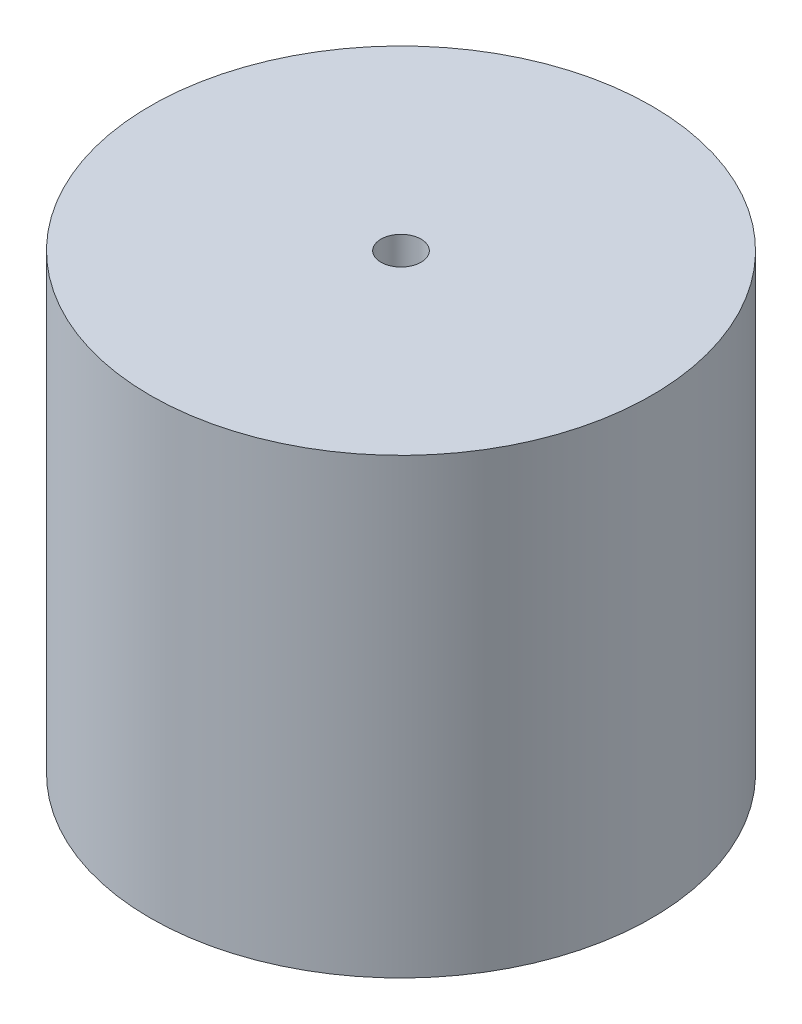
ISO-10303-21;
HEADER;
FILE_DESCRIPTION(('STEP AP214'),'2;1');
FILE_NAME('part.step','',(''),(''),'','','');
FILE_SCHEMA(('AUTOMOTIVE_DESIGN { 1 0 10303 214 1 1 1 1 }'));
ENDSEC;
DATA;
#1=APPLICATION_CONTEXT('core data for automotive mechanical design processes');
#2=APPLICATION_PROTOCOL_DEFINITION('international standard','automotive_design',2000,#1);
#3=PRODUCT_CONTEXT('',#1,'mechanical');
#4=PRODUCT('Part','Part','',(#3));
#5=PRODUCT_RELATED_PRODUCT_CATEGORY('part','',(#4));
#6=PRODUCT_DEFINITION_FORMATION('','',#4);
#7=PRODUCT_DEFINITION_CONTEXT('part definition',#1,'design');
#8=PRODUCT_DEFINITION('design','',#6,#7);
#9=PRODUCT_DEFINITION_SHAPE('','',#8);
#10=(LENGTH_UNIT() NAMED_UNIT(*) SI_UNIT(.MILLI.,.METRE.));
#11=(NAMED_UNIT(*) PLANE_ANGLE_UNIT() SI_UNIT($,.RADIAN.));
#12=(NAMED_UNIT(*) SI_UNIT($,.STERADIAN.) SOLID_ANGLE_UNIT());
#13=UNCERTAINTY_MEASURE_WITH_UNIT(LENGTH_MEASURE(1.E-05),#10,'distance_accuracy_value','');
#14=(GEOMETRIC_REPRESENTATION_CONTEXT(3) GLOBAL_UNCERTAINTY_ASSIGNED_CONTEXT((#13)) GLOBAL_UNIT_ASSIGNED_CONTEXT((#10,
#11,#12)) REPRESENTATION_CONTEXT('',''));
#15=CARTESIAN_POINT('',(0.,0.,0.));
#16=DIRECTION('',(0.,0.,1.));
#17=DIRECTION('',(1.,0.,0.));
#18=AXIS2_PLACEMENT_3D('',#15,#16,#17);
#19=CARTESIAN_POINT('',(0.,110.,0.));
#20=DIRECTION('',(0.,-1.,0.));
#21=DIRECTION('',(0.,0.,-1.));
#22=AXIS2_PLACEMENT_3D('',#19,#20,#21);
#23=CYLINDRICAL_SURFACE('',#22,65.);
#24=CARTESIAN_POINT('',(0.,110.,0.));
#25=DIRECTION('',(0.,-1.,0.));
#26=DIRECTION('',(0.,0.,-1.));
#27=AXIS2_PLACEMENT_3D('',#24,#25,#26);
#28=CIRCLE('',#27,65.);
#29=CARTESIAN_POINT('',(0.,110.,-65.));
#30=VERTEX_POINT('',#29);
#31=EDGE_CURVE('E53',#30,#30,#28,.T.);
#32=ORIENTED_EDGE('',*,*,#31,.F.);
#33=EDGE_LOOP('',(#32));
#34=FACE_BOUND('',#33,.T.);
#35=CARTESIAN_POINT('',(0.,9.99999999999999,0.));
#36=DIRECTION('',(0.,-1.,0.));
#37=DIRECTION('',(0.,0.,-1.));
#38=AXIS2_PLACEMENT_3D('',#35,#36,#37);
#39=CIRCLE('',#38,65.);
#40=CARTESIAN_POINT('',(0.,9.99999999999999,-65.));
#41=VERTEX_POINT('',#40);
#42=EDGE_CURVE('E10',#41,#41,#39,.F.);
#43=ORIENTED_EDGE('',*,*,#42,.F.);
#44=EDGE_LOOP('',(#43));
#45=FACE_BOUND('',#44,.T.);
#46=ADVANCED_FACE('F31',(#34,#45),#23,.F.);
#47=CARTESIAN_POINT('',(0.,135.4,0.));
#48=DIRECTION('',(0.,-1.,0.));
#49=DIRECTION('',(0.,0.,-1.));
#50=AXIS2_PLACEMENT_3D('',#47,#48,#49);
#51=CYLINDRICAL_SURFACE('',#50,6.);
#52=CARTESIAN_POINT('',(0.,135.4,0.));
#53=DIRECTION('',(0.,1.,0.));
#54=DIRECTION('',(0.,0.,1.));
#55=AXIS2_PLACEMENT_3D('',#52,#53,#54);
#56=CIRCLE('',#55,6.);
#57=CARTESIAN_POINT('',(0.,135.4,6.));
#58=VERTEX_POINT('',#57);
#59=EDGE_CURVE('E47',#58,#58,#56,.T.);
#60=ORIENTED_EDGE('',*,*,#59,.T.);
#61=EDGE_LOOP('',(#60));
#62=FACE_BOUND('',#61,.T.);
#63=CARTESIAN_POINT('',(0.,110.,0.));
#64=DIRECTION('',(0.,-1.,0.));
#65=DIRECTION('',(0.,0.,-1.));
#66=AXIS2_PLACEMENT_3D('',#63,#64,#65);
#67=CIRCLE('',#66,6.);
#68=CARTESIAN_POINT('',(0.,110.,-6.));
#69=VERTEX_POINT('',#68);
#70=EDGE_CURVE('E51',#69,#69,#67,.T.);
#71=ORIENTED_EDGE('',*,*,#70,.T.);
#72=EDGE_LOOP('',(#71));
#73=FACE_BOUND('',#72,.T.);
#74=ADVANCED_FACE('F80',(#62,#73),#51,.F.);
#75=CARTESIAN_POINT('',(0.,135.4,0.));
#76=DIRECTION('',(0.,1.,0.));
#77=DIRECTION('',(0.,0.,1.));
#78=AXIS2_PLACEMENT_3D('',#75,#76,#77);
#79=PLANE('',#78);
#80=CARTESIAN_POINT('',(0.,135.4,0.));
#81=DIRECTION('',(0.,1.,0.));
#82=DIRECTION('',(0.,0.,1.));
#83=AXIS2_PLACEMENT_3D('',#80,#81,#82);
#84=CIRCLE('',#83,75.);
#85=CARTESIAN_POINT('',(0.,135.4,75.));
#86=VERTEX_POINT('',#85);
#87=EDGE_CURVE('E38',#86,#86,#84,.T.);
#88=ORIENTED_EDGE('',*,*,#87,.T.);
#89=EDGE_LOOP('',(#88));
#90=FACE_BOUND('',#89,.T.);
#91=ORIENTED_EDGE('',*,*,#59,.F.);
#92=EDGE_LOOP('',(#91));
#93=FACE_BOUND('',#92,.T.);
#94=ADVANCED_FACE('F72',(#90,#93),#79,.T.);
#95=CARTESIAN_POINT('',(0.,0.,0.));
#96=DIRECTION('',(0.,1.,0.));
#97=DIRECTION('',(0.,0.,1.));
#98=AXIS2_PLACEMENT_3D('',#95,#96,#97);
#99=PLANE('',#98);
#100=CARTESIAN_POINT('',(0.,0.,0.));
#101=DIRECTION('',(0.,1.,0.));
#102=DIRECTION('',(0.,0.,1.));
#103=AXIS2_PLACEMENT_3D('',#100,#101,#102);
#104=CIRCLE('',#103,75.);
#105=CARTESIAN_POINT('',(0.,0.,75.));
#106=VERTEX_POINT('',#105);
#107=EDGE_CURVE('E42',#106,#106,#104,.T.);
#108=ORIENTED_EDGE('',*,*,#107,.F.);
#109=EDGE_LOOP('',(#108));
#110=FACE_BOUND('',#109,.T.);
#111=CARTESIAN_POINT('',(0.,0.,0.));
#112=DIRECTION('',(0.,-1.,0.));
#113=DIRECTION('',(0.,0.,-1.));
#114=AXIS2_PLACEMENT_3D('',#111,#112,#113);
#115=CIRCLE('',#114,6.);
#116=CARTESIAN_POINT('',(0.,0.,-6.));
#117=VERTEX_POINT('',#116);
#118=EDGE_CURVE('E62',#117,#117,#115,.T.);
#119=ORIENTED_EDGE('',*,*,#118,.F.);
#120=EDGE_LOOP('',(#119));
#121=FACE_BOUND('',#120,.T.);
#122=ADVANCED_FACE('F70',(#110,#121),#99,.F.);
#123=CARTESIAN_POINT('',(0.,135.4,0.));
#124=DIRECTION('',(0.,-1.,0.));
#125=DIRECTION('',(0.,0.,-1.));
#126=AXIS2_PLACEMENT_3D('',#123,#124,#125);
#127=CYLINDRICAL_SURFACE('',#126,75.);
#128=ORIENTED_EDGE('',*,*,#107,.T.);
#129=EDGE_LOOP('',(#128));
#130=FACE_BOUND('',#129,.T.);
#131=ORIENTED_EDGE('',*,*,#87,.F.);
#132=EDGE_LOOP('',(#131));
#133=FACE_BOUND('',#132,.T.);
#134=ADVANCED_FACE('F33',(#130,#133),#127,.T.);
#135=CARTESIAN_POINT('',(0.,110.,0.));
#136=DIRECTION('',(0.,-1.,0.));
#137=DIRECTION('',(0.,0.,-1.));
#138=AXIS2_PLACEMENT_3D('',#135,#136,#137);
#139=PLANE('',#138);
#140=ORIENTED_EDGE('',*,*,#70,.F.);
#141=EDGE_LOOP('',(#140));
#142=FACE_BOUND('',#141,.T.);
#143=ORIENTED_EDGE('',*,*,#31,.T.);
#144=EDGE_LOOP('',(#143));
#145=FACE_BOUND('',#144,.T.);
#146=ADVANCED_FACE('F78',(#142,#145),#139,.T.);
#147=CARTESIAN_POINT('',(0.,10.,0.));
#148=DIRECTION('',(0.,-1.,0.));
#149=DIRECTION('',(0.,0.,-1.));
#150=AXIS2_PLACEMENT_3D('',#147,#148,#149);
#151=PLANE('',#150);
#152=CARTESIAN_POINT('',(0.,10.,0.));
#153=DIRECTION('',(0.,-1.,0.));
#154=DIRECTION('',(0.,0.,-1.));
#155=AXIS2_PLACEMENT_3D('',#152,#153,#154);
#156=CIRCLE('',#155,6.);
#157=CARTESIAN_POINT('',(0.,10.,-6.));
#158=VERTEX_POINT('',#157);
#159=EDGE_CURVE('E58',#158,#158,#156,.T.);
#160=ORIENTED_EDGE('',*,*,#159,.T.);
#161=EDGE_LOOP('',(#160));
#162=FACE_BOUND('',#161,.T.);
#163=ORIENTED_EDGE('',*,*,#42,.T.);
#164=EDGE_LOOP('',(#163));
#165=FACE_BOUND('',#164,.T.);
#166=ADVANCED_FACE('F95',(#162,#165),#151,.F.);
#167=CARTESIAN_POINT('',(0.,10.,0.));
#168=DIRECTION('',(0.,-1.,0.));
#169=DIRECTION('',(0.,0.,-1.));
#170=AXIS2_PLACEMENT_3D('',#167,#168,#169);
#171=CYLINDRICAL_SURFACE('',#170,6.);
#172=ORIENTED_EDGE('',*,*,#159,.F.);
#173=EDGE_LOOP('',(#172));
#174=FACE_BOUND('',#173,.T.);
#175=ORIENTED_EDGE('',*,*,#118,.T.);
#176=EDGE_LOOP('',(#175));
#177=FACE_BOUND('',#176,.T.);
#178=ADVANCED_FACE('F68',(#174,#177),#171,.F.);
#179=CLOSED_SHELL('',(#46,#74,#94,#122,#134,#146,#166,#178));
#180=MANIFOLD_SOLID_BREP('B2',#179);
#181=ADVANCED_BREP_SHAPE_REPRESENTATION('',(#18,#180),#14);
#182=SHAPE_DEFINITION_REPRESENTATION(#9,#181);
ENDSEC;
END-ISO-10303-21;
